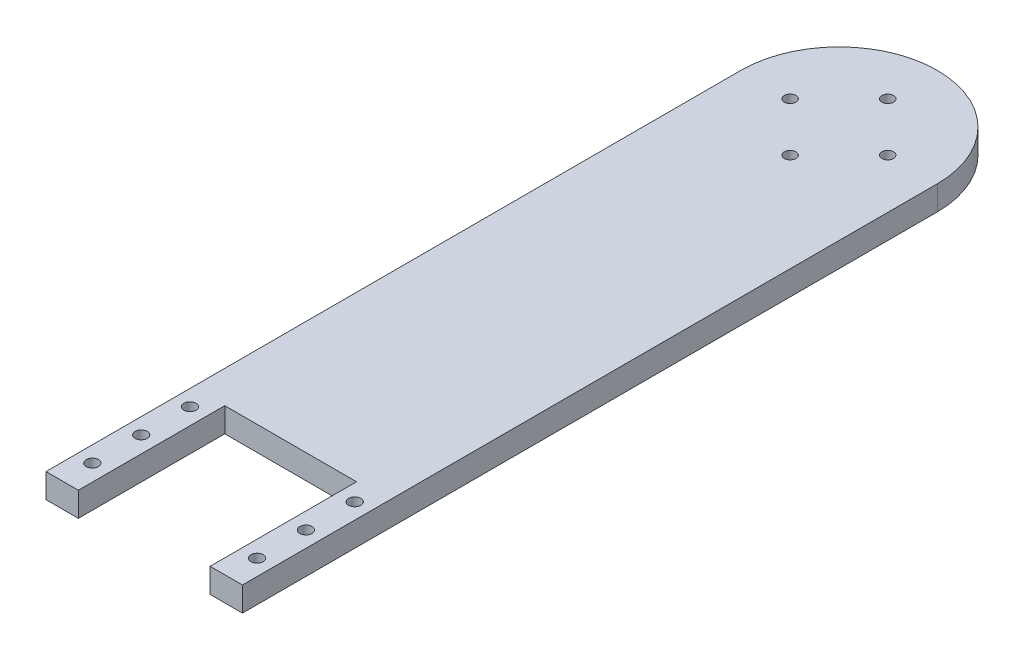
ISO-10303-21;
HEADER;
FILE_DESCRIPTION(('STEP AP214'),'2;1');
FILE_NAME('part.step','',(''),(''),'','','');
FILE_SCHEMA(('AUTOMOTIVE_DESIGN { 1 0 10303 214 1 1 1 1 }'));
ENDSEC;
DATA;
#1=APPLICATION_CONTEXT('core data for automotive mechanical design processes');
#2=APPLICATION_PROTOCOL_DEFINITION('international standard','automotive_design',2000,#1);
#3=PRODUCT_CONTEXT('',#1,'mechanical');
#4=PRODUCT('Part','Part','',(#3));
#5=PRODUCT_RELATED_PRODUCT_CATEGORY('part','',(#4));
#6=PRODUCT_DEFINITION_FORMATION('','',#4);
#7=PRODUCT_DEFINITION_CONTEXT('part definition',#1,'design');
#8=PRODUCT_DEFINITION('design','',#6,#7);
#9=PRODUCT_DEFINITION_SHAPE('','',#8);
#10=(LENGTH_UNIT() NAMED_UNIT(*) SI_UNIT(.MILLI.,.METRE.));
#11=(NAMED_UNIT(*) PLANE_ANGLE_UNIT() SI_UNIT($,.RADIAN.));
#12=(NAMED_UNIT(*) SI_UNIT($,.STERADIAN.) SOLID_ANGLE_UNIT());
#13=UNCERTAINTY_MEASURE_WITH_UNIT(LENGTH_MEASURE(1.E-05),#10,'distance_accuracy_value','');
#14=(GEOMETRIC_REPRESENTATION_CONTEXT(3) GLOBAL_UNCERTAINTY_ASSIGNED_CONTEXT((#13)) GLOBAL_UNIT_ASSIGNED_CONTEXT((#10,
#11,#12)) REPRESENTATION_CONTEXT('',''));
#15=CARTESIAN_POINT('',(0.,0.,0.));
#16=DIRECTION('',(0.,0.,1.));
#17=DIRECTION('',(1.,0.,0.));
#18=AXIS2_PLACEMENT_3D('',#15,#16,#17);
#19=CARTESIAN_POINT('',(-16.1,4.,113.9));
#20=DIRECTION('',(0.,0.,-1.));
#21=DIRECTION('',(-1.,0.,0.));
#22=AXIS2_PLACEMENT_3D('',#19,#20,#21);
#23=PLANE('',#22);
#24=DIRECTION('',(1.,0.,0.));
#25=VECTOR('',#24,1.);
#26=CARTESIAN_POINT('',(-16.1,4.,113.9));
#27=LINE('',#26,#25);
#28=CARTESIAN_POINT('',(10.8,4.,113.9));
#29=VERTEX_POINT('',#28);
#30=CARTESIAN_POINT('',(16.1,4.,113.9));
#31=VERTEX_POINT('',#30);
#32=EDGE_CURVE('E203',#29,#31,#27,.T.);
#33=ORIENTED_EDGE('',*,*,#32,.F.);
#34=DIRECTION('',(0.,1.,0.));
#35=VECTOR('',#34,1.);
#36=CARTESIAN_POINT('',(10.8,-6.,113.9));
#37=LINE('',#36,#35);
#38=CARTESIAN_POINT('',(10.8,0.,113.9));
#39=VERTEX_POINT('',#38);
#40=EDGE_CURVE('E134',#39,#29,#37,.T.);
#41=ORIENTED_EDGE('',*,*,#40,.F.);
#42=DIRECTION('',(1.,0.,0.));
#43=VECTOR('',#42,1.);
#44=CARTESIAN_POINT('',(-16.1,0.,113.9));
#45=LINE('',#44,#43);
#46=CARTESIAN_POINT('',(16.1,0.,113.9));
#47=VERTEX_POINT('',#46);
#48=EDGE_CURVE('E68',#39,#47,#45,.T.);
#49=ORIENTED_EDGE('',*,*,#48,.T.);
#50=DIRECTION('',(0.,-1.,0.));
#51=VECTOR('',#50,1.);
#52=CARTESIAN_POINT('',(16.1,4.,113.9));
#53=LINE('',#52,#51);
#54=EDGE_CURVE('E216',#31,#47,#53,.T.);
#55=ORIENTED_EDGE('',*,*,#54,.F.);
#56=EDGE_LOOP('',(#33,#41,#49,#55));
#57=FACE_BOUND('',#56,.T.);
#58=ADVANCED_FACE('F33',(#57),#23,.F.);
#59=CARTESIAN_POINT('',(-16.1,0.,113.9));
#60=VERTEX_POINT('',#59);
#61=CARTESIAN_POINT('',(-10.8,0.,113.9));
#62=VERTEX_POINT('',#61);
#63=EDGE_CURVE('E211',#60,#62,#45,.T.);
#64=ORIENTED_EDGE('',*,*,#63,.T.);
#65=DIRECTION('',(0.,1.,0.));
#66=VECTOR('',#65,1.);
#67=CARTESIAN_POINT('',(-10.8,-6.,113.9));
#68=LINE('',#67,#66);
#69=CARTESIAN_POINT('',(-10.8,4.,113.9));
#70=VERTEX_POINT('',#69);
#71=EDGE_CURVE('E119',#62,#70,#68,.T.);
#72=ORIENTED_EDGE('',*,*,#71,.T.);
#73=CARTESIAN_POINT('',(-16.1,4.,113.9));
#74=VERTEX_POINT('',#73);
#75=EDGE_CURVE('E131',#74,#70,#27,.T.);
#76=ORIENTED_EDGE('',*,*,#75,.F.);
#77=DIRECTION('',(0.,-1.,0.));
#78=VECTOR('',#77,1.);
#79=CARTESIAN_POINT('',(-16.1,4.,113.9));
#80=LINE('',#79,#78);
#81=EDGE_CURVE('E218',#74,#60,#80,.T.);
#82=ORIENTED_EDGE('',*,*,#81,.T.);
#83=EDGE_LOOP('',(#64,#72,#76,#82));
#84=FACE_BOUND('',#83,.T.);
#85=ADVANCED_FACE('F238',(#84),#23,.F.);
#86=CARTESIAN_POINT('',(0.,4.,0.));
#87=DIRECTION('',(0.,1.,0.));
#88=DIRECTION('',(0.,0.,1.));
#89=AXIS2_PLACEMENT_3D('',#86,#87,#88);
#90=PLANE('',#89);
#91=DIRECTION('',(0.,0.,1.));
#92=VECTOR('',#91,1.);
#93=CARTESIAN_POINT('',(-10.8,4.,0.));
#94=LINE('',#93,#92);
#95=CARTESIAN_POINT('',(-10.8,4.,89.9));
#96=VERTEX_POINT('',#95);
#97=EDGE_CURVE('E124',#96,#70,#94,.T.);
#98=ORIENTED_EDGE('',*,*,#97,.F.);
#99=DIRECTION('',(1.,0.,0.));
#100=VECTOR('',#99,1.);
#101=CARTESIAN_POINT('',(-8.68397598925233,4.,89.9));
#102=LINE('',#101,#100);
#103=CARTESIAN_POINT('',(10.8,4.,89.9));
#104=VERTEX_POINT('',#103);
#105=EDGE_CURVE('E109',#96,#104,#102,.T.);
#106=ORIENTED_EDGE('',*,*,#105,.T.);
#107=DIRECTION('',(0.,0.,-1.));
#108=VECTOR('',#107,1.);
#109=CARTESIAN_POINT('',(10.8,4.,113.9));
#110=LINE('',#109,#108);
#111=EDGE_CURVE('E132',#29,#104,#110,.T.);
#112=ORIENTED_EDGE('',*,*,#111,.F.);
#113=ORIENTED_EDGE('',*,*,#32,.T.);
#114=DIRECTION('',(0.,0.,-1.));
#115=VECTOR('',#114,1.);
#116=CARTESIAN_POINT('',(16.1,4.,113.9));
#117=LINE('',#116,#115);
#118=CARTESIAN_POINT('',(16.1,4.,0.));
#119=VERTEX_POINT('',#118);
#120=EDGE_CURVE('E50',#31,#119,#117,.T.);
#121=ORIENTED_EDGE('',*,*,#120,.T.);
#122=CARTESIAN_POINT('',(0.,4.,0.));
#123=DIRECTION('',(0.,1.,0.));
#124=DIRECTION('',(0.,0.,1.));
#125=AXIS2_PLACEMENT_3D('',#122,#123,#124);
#126=CIRCLE('',#125,16.1);
#127=CARTESIAN_POINT('',(-16.1,4.,0.));
#128=VERTEX_POINT('',#127);
#129=EDGE_CURVE('E200',#119,#128,#126,.T.);
#130=ORIENTED_EDGE('',*,*,#129,.T.);
#131=DIRECTION('',(0.,0.,1.));
#132=VECTOR('',#131,1.);
#133=CARTESIAN_POINT('',(-16.1,4.,0.));
#134=LINE('',#133,#132);
#135=EDGE_CURVE('E82',#128,#74,#134,.T.);
#136=ORIENTED_EDGE('',*,*,#135,.T.);
#137=ORIENTED_EDGE('',*,*,#75,.T.);
#138=EDGE_LOOP('',(#98,#106,#112,#113,#121,#130,#136,#137));
#139=FACE_BOUND('',#138,.T.);
#140=CARTESIAN_POINT('',(-0.0249024443971411,4.,-7.99772856499219));
#141=DIRECTION('',(0.,1.,0.));
#142=DIRECTION('',(0.,0.,1.));
#143=AXIS2_PLACEMENT_3D('',#140,#141,#142);
#144=CIRCLE('',#143,0.955);
#145=CARTESIAN_POINT('',(-0.0249024443971411,4.,-7.04272856499219));
#146=VERTEX_POINT('',#145);
#147=EDGE_CURVE('E153',#146,#146,#144,.T.);
#148=ORIENTED_EDGE('',*,*,#147,.F.);
#149=EDGE_LOOP('',(#148));
#150=FACE_BOUND('',#149,.T.);
#151=CARTESIAN_POINT('',(-13.5,4.,100.9));
#152=DIRECTION('',(0.,1.,0.));
#153=DIRECTION('',(0.,0.,1.));
#154=AXIS2_PLACEMENT_3D('',#151,#152,#153);
#155=CIRCLE('',#154,1.);
#156=CARTESIAN_POINT('',(-13.5,4.,101.9));
#157=VERTEX_POINT('',#156);
#158=EDGE_CURVE('E166',#157,#157,#155,.T.);
#159=ORIENTED_EDGE('',*,*,#158,.F.);
#160=EDGE_LOOP('',(#159));
#161=FACE_BOUND('',#160,.T.);
#162=CARTESIAN_POINT('',(-13.5,4.,92.9));
#163=DIRECTION('',(0.,1.,0.));
#164=DIRECTION('',(0.,0.,1.));
#165=AXIS2_PLACEMENT_3D('',#162,#163,#164);
#166=CIRCLE('',#165,1.);
#167=CARTESIAN_POINT('',(-13.5,4.,93.9));
#168=VERTEX_POINT('',#167);
#169=EDGE_CURVE('E173',#168,#168,#166,.T.);
#170=ORIENTED_EDGE('',*,*,#169,.F.);
#171=EDGE_LOOP('',(#170));
#172=FACE_BOUND('',#171,.T.);
#173=CARTESIAN_POINT('',(13.5,4.,92.9));
#174=DIRECTION('',(0.,1.,0.));
#175=DIRECTION('',(0.,0.,1.));
#176=AXIS2_PLACEMENT_3D('',#173,#174,#175);
#177=CIRCLE('',#176,1.);
#178=CARTESIAN_POINT('',(13.5,4.,93.9));
#179=VERTEX_POINT('',#178);
#180=EDGE_CURVE('E179',#179,#179,#177,.T.);
#181=ORIENTED_EDGE('',*,*,#180,.F.);
#182=EDGE_LOOP('',(#181));
#183=FACE_BOUND('',#182,.T.);
#184=CARTESIAN_POINT('',(13.5,4.,100.9));
#185=DIRECTION('',(0.,1.,0.));
#186=DIRECTION('',(0.,0.,1.));
#187=AXIS2_PLACEMENT_3D('',#184,#185,#186);
#188=CIRCLE('',#187,1.);
#189=CARTESIAN_POINT('',(13.5,4.,101.9));
#190=VERTEX_POINT('',#189);
#191=EDGE_CURVE('E185',#190,#190,#188,.T.);
#192=ORIENTED_EDGE('',*,*,#191,.F.);
#193=EDGE_LOOP('',(#192));
#194=FACE_BOUND('',#193,.T.);
#195=CARTESIAN_POINT('',(7.97509755560286,4.,0.00227143500781436));
#196=DIRECTION('',(0.,1.,0.));
#197=DIRECTION('',(0.,0.,1.));
#198=AXIS2_PLACEMENT_3D('',#195,#196,#197);
#199=CIRCLE('',#198,0.954999999999999);
#200=CARTESIAN_POINT('',(7.97509755560286,4.,0.957271435007814));
#201=VERTEX_POINT('',#200);
#202=EDGE_CURVE('E147',#201,#201,#199,.T.);
#203=ORIENTED_EDGE('',*,*,#202,.F.);
#204=EDGE_LOOP('',(#203));
#205=FACE_BOUND('',#204,.T.);
#206=CARTESIAN_POINT('',(-0.0249024443971411,4.,8.00227143500781));
#207=DIRECTION('',(0.,1.,0.));
#208=DIRECTION('',(0.,0.,1.));
#209=AXIS2_PLACEMENT_3D('',#206,#207,#208);
#210=CIRCLE('',#209,0.955);
#211=CARTESIAN_POINT('',(-0.0249024443971411,4.,8.95727143500781));
#212=VERTEX_POINT('',#211);
#213=EDGE_CURVE('E140',#212,#212,#210,.T.);
#214=ORIENTED_EDGE('',*,*,#213,.F.);
#215=EDGE_LOOP('',(#214));
#216=FACE_BOUND('',#215,.T.);
#217=CARTESIAN_POINT('',(-8.02490244439714,4.,0.00227143500781436));
#218=DIRECTION('',(0.,1.,0.));
#219=DIRECTION('',(0.,0.,1.));
#220=AXIS2_PLACEMENT_3D('',#217,#218,#219);
#221=CIRCLE('',#220,0.955);
#222=CARTESIAN_POINT('',(-8.02490244439714,4.,0.957271435007815));
#223=VERTEX_POINT('',#222);
#224=EDGE_CURVE('E161',#223,#223,#221,.T.);
#225=ORIENTED_EDGE('',*,*,#224,.F.);
#226=EDGE_LOOP('',(#225));
#227=FACE_BOUND('',#226,.T.);
#228=CARTESIAN_POINT('',(13.5,4.,108.9));
#229=DIRECTION('',(0.,1.,0.));
#230=DIRECTION('',(0.,0.,1.));
#231=AXIS2_PLACEMENT_3D('',#228,#229,#230);
#232=CIRCLE('',#231,1.);
#233=CARTESIAN_POINT('',(13.5,4.,109.9));
#234=VERTEX_POINT('',#233);
#235=EDGE_CURVE('E154',#234,#234,#232,.T.);
#236=ORIENTED_EDGE('',*,*,#235,.F.);
#237=EDGE_LOOP('',(#236));
#238=FACE_BOUND('',#237,.T.);
#239=CARTESIAN_POINT('',(-13.5,4.,108.9));
#240=DIRECTION('',(0.,1.,0.));
#241=DIRECTION('',(0.,0.,1.));
#242=AXIS2_PLACEMENT_3D('',#239,#240,#241);
#243=CIRCLE('',#242,1.);
#244=CARTESIAN_POINT('',(-13.5,4.,109.9));
#245=VERTEX_POINT('',#244);
#246=EDGE_CURVE('E169',#245,#245,#243,.T.);
#247=ORIENTED_EDGE('',*,*,#246,.F.);
#248=EDGE_LOOP('',(#247));
#249=FACE_BOUND('',#248,.T.);
#250=ADVANCED_FACE('F128',(#139,#150,#161,#172,#183,#194,#205,#216,#227,#238,#249),#90,.T.);
#251=CARTESIAN_POINT('',(0.,0.,0.));
#252=DIRECTION('',(0.,1.,0.));
#253=DIRECTION('',(0.,0.,1.));
#254=AXIS2_PLACEMENT_3D('',#251,#252,#253);
#255=PLANE('',#254);
#256=CARTESIAN_POINT('',(-13.5,0.,108.9));
#257=DIRECTION('',(0.,1.,0.));
#258=DIRECTION('',(0.,0.,1.));
#259=AXIS2_PLACEMENT_3D('',#256,#257,#258);
#260=CIRCLE('',#259,1.);
#261=CARTESIAN_POINT('',(-13.5,0.,109.9));
#262=VERTEX_POINT('',#261);
#263=EDGE_CURVE('E194',#262,#262,#260,.T.);
#264=ORIENTED_EDGE('',*,*,#263,.T.);
#265=EDGE_LOOP('',(#264));
#266=FACE_BOUND('',#265,.T.);
#267=CARTESIAN_POINT('',(13.5,0.,108.9));
#268=DIRECTION('',(0.,1.,0.));
#269=DIRECTION('',(0.,0.,1.));
#270=AXIS2_PLACEMENT_3D('',#267,#268,#269);
#271=CIRCLE('',#270,1.);
#272=CARTESIAN_POINT('',(13.5,0.,109.9));
#273=VERTEX_POINT('',#272);
#274=EDGE_CURVE('E158',#273,#273,#271,.T.);
#275=ORIENTED_EDGE('',*,*,#274,.T.);
#276=EDGE_LOOP('',(#275));
#277=FACE_BOUND('',#276,.T.);
#278=CARTESIAN_POINT('',(-8.02490244439714,0.,0.00227143500781436));
#279=DIRECTION('',(0.,1.,0.));
#280=DIRECTION('',(0.,0.,1.));
#281=AXIS2_PLACEMENT_3D('',#278,#279,#280);
#282=CIRCLE('',#281,0.955);
#283=CARTESIAN_POINT('',(-8.02490244439714,0.,0.957271435007815));
#284=VERTEX_POINT('',#283);
#285=EDGE_CURVE('E143',#284,#284,#282,.T.);
#286=ORIENTED_EDGE('',*,*,#285,.T.);
#287=EDGE_LOOP('',(#286));
#288=FACE_BOUND('',#287,.T.);
#289=CARTESIAN_POINT('',(-0.0249024443971411,0.,8.00227143500781));
#290=DIRECTION('',(0.,1.,0.));
#291=DIRECTION('',(0.,0.,1.));
#292=AXIS2_PLACEMENT_3D('',#289,#290,#291);
#293=CIRCLE('',#292,0.955);
#294=CARTESIAN_POINT('',(-0.0249024443971411,0.,8.95727143500781));
#295=VERTEX_POINT('',#294);
#296=EDGE_CURVE('E144',#295,#295,#293,.T.);
#297=ORIENTED_EDGE('',*,*,#296,.T.);
#298=EDGE_LOOP('',(#297));
#299=FACE_BOUND('',#298,.T.);
#300=CARTESIAN_POINT('',(7.97509755560286,0.,0.00227143500781436));
#301=DIRECTION('',(0.,1.,0.));
#302=DIRECTION('',(0.,0.,1.));
#303=AXIS2_PLACEMENT_3D('',#300,#301,#302);
#304=CIRCLE('',#303,0.954999999999999);
#305=CARTESIAN_POINT('',(7.97509755560286,0.,0.957271435007814));
#306=VERTEX_POINT('',#305);
#307=EDGE_CURVE('E150',#306,#306,#304,.T.);
#308=ORIENTED_EDGE('',*,*,#307,.T.);
#309=EDGE_LOOP('',(#308));
#310=FACE_BOUND('',#309,.T.);
#311=CARTESIAN_POINT('',(13.5,0.,100.9));
#312=DIRECTION('',(0.,1.,0.));
#313=DIRECTION('',(0.,0.,1.));
#314=AXIS2_PLACEMENT_3D('',#311,#312,#313);
#315=CIRCLE('',#314,1.);
#316=CARTESIAN_POINT('',(13.5,0.,101.9));
#317=VERTEX_POINT('',#316);
#318=EDGE_CURVE('E157',#317,#317,#315,.T.);
#319=ORIENTED_EDGE('',*,*,#318,.T.);
#320=EDGE_LOOP('',(#319));
#321=FACE_BOUND('',#320,.T.);
#322=CARTESIAN_POINT('',(13.5,0.,92.9));
#323=DIRECTION('',(0.,1.,0.));
#324=DIRECTION('',(0.,0.,1.));
#325=AXIS2_PLACEMENT_3D('',#322,#323,#324);
#326=CIRCLE('',#325,1.);
#327=CARTESIAN_POINT('',(13.5,0.,93.9));
#328=VERTEX_POINT('',#327);
#329=EDGE_CURVE('E182',#328,#328,#326,.T.);
#330=ORIENTED_EDGE('',*,*,#329,.T.);
#331=EDGE_LOOP('',(#330));
#332=FACE_BOUND('',#331,.T.);
#333=CARTESIAN_POINT('',(-13.5,0.,92.9));
#334=DIRECTION('',(0.,1.,0.));
#335=DIRECTION('',(0.,0.,1.));
#336=AXIS2_PLACEMENT_3D('',#333,#334,#335);
#337=CIRCLE('',#336,1.);
#338=CARTESIAN_POINT('',(-13.5,0.,93.9));
#339=VERTEX_POINT('',#338);
#340=EDGE_CURVE('E176',#339,#339,#337,.T.);
#341=ORIENTED_EDGE('',*,*,#340,.T.);
#342=EDGE_LOOP('',(#341));
#343=FACE_BOUND('',#342,.T.);
#344=CARTESIAN_POINT('',(-13.5,0.,100.9));
#345=DIRECTION('',(0.,1.,0.));
#346=DIRECTION('',(0.,0.,1.));
#347=AXIS2_PLACEMENT_3D('',#344,#345,#346);
#348=CIRCLE('',#347,1.);
#349=CARTESIAN_POINT('',(-13.5,0.,101.9));
#350=VERTEX_POINT('',#349);
#351=EDGE_CURVE('E170',#350,#350,#348,.T.);
#352=ORIENTED_EDGE('',*,*,#351,.T.);
#353=EDGE_LOOP('',(#352));
#354=FACE_BOUND('',#353,.T.);
#355=CARTESIAN_POINT('',(-0.0249024443971411,0.,-7.99772856499219));
#356=DIRECTION('',(0.,1.,0.));
#357=DIRECTION('',(0.,0.,1.));
#358=AXIS2_PLACEMENT_3D('',#355,#356,#357);
#359=CIRCLE('',#358,0.955);
#360=CARTESIAN_POINT('',(-0.0249024443971411,0.,-7.04272856499219));
#361=VERTEX_POINT('',#360);
#362=EDGE_CURVE('E118',#361,#361,#359,.T.);
#363=ORIENTED_EDGE('',*,*,#362,.T.);
#364=EDGE_LOOP('',(#363));
#365=FACE_BOUND('',#364,.T.);
#366=DIRECTION('',(1.,0.,0.));
#367=VECTOR('',#366,1.);
#368=CARTESIAN_POINT('',(0.,0.,89.9));
#369=LINE('',#368,#367);
#370=CARTESIAN_POINT('',(-10.8,0.,89.9));
#371=VERTEX_POINT('',#370);
#372=CARTESIAN_POINT('',(10.8,0.,89.9));
#373=VERTEX_POINT('',#372);
#374=EDGE_CURVE('E223',#371,#373,#369,.T.);
#375=ORIENTED_EDGE('',*,*,#374,.F.);
#376=DIRECTION('',(0.,0.,1.));
#377=VECTOR('',#376,1.);
#378=CARTESIAN_POINT('',(-10.8,0.,0.));
#379=LINE('',#378,#377);
#380=EDGE_CURVE('E11',#371,#62,#379,.T.);
#381=ORIENTED_EDGE('',*,*,#380,.T.);
#382=ORIENTED_EDGE('',*,*,#63,.F.);
#383=DIRECTION('',(0.,0.,1.));
#384=VECTOR('',#383,1.);
#385=CARTESIAN_POINT('',(-16.1,0.,0.));
#386=LINE('',#385,#384);
#387=CARTESIAN_POINT('',(-16.1,0.,0.));
#388=VERTEX_POINT('',#387);
#389=EDGE_CURVE('E209',#388,#60,#386,.T.);
#390=ORIENTED_EDGE('',*,*,#389,.F.);
#391=CARTESIAN_POINT('',(0.,0.,0.));
#392=DIRECTION('',(0.,1.,0.));
#393=DIRECTION('',(0.,0.,1.));
#394=AXIS2_PLACEMENT_3D('',#391,#392,#393);
#395=CIRCLE('',#394,16.1);
#396=CARTESIAN_POINT('',(16.1,0.,0.));
#397=VERTEX_POINT('',#396);
#398=EDGE_CURVE('E197',#397,#388,#395,.T.);
#399=ORIENTED_EDGE('',*,*,#398,.F.);
#400=DIRECTION('',(0.,0.,-1.));
#401=VECTOR('',#400,1.);
#402=CARTESIAN_POINT('',(16.1,0.,113.9));
#403=LINE('',#402,#401);
#404=EDGE_CURVE('E74',#47,#397,#403,.T.);
#405=ORIENTED_EDGE('',*,*,#404,.F.);
#406=ORIENTED_EDGE('',*,*,#48,.F.);
#407=DIRECTION('',(0.,0.,-1.));
#408=VECTOR('',#407,1.);
#409=CARTESIAN_POINT('',(10.8,0.,0.));
#410=LINE('',#409,#408);
#411=EDGE_CURVE('E42',#39,#373,#410,.T.);
#412=ORIENTED_EDGE('',*,*,#411,.T.);
#413=EDGE_LOOP('',(#375,#381,#382,#390,#399,#405,#406,#412));
#414=FACE_BOUND('',#413,.T.);
#415=ADVANCED_FACE('F226',(#266,#277,#288,#299,#310,#321,#332,#343,#354,#365,#414),#255,.F.);
#416=CARTESIAN_POINT('',(0.,4.,0.));
#417=DIRECTION('',(0.,-1.,0.));
#418=DIRECTION('',(0.,0.,-1.));
#419=AXIS2_PLACEMENT_3D('',#416,#417,#418);
#420=CYLINDRICAL_SURFACE('',#419,16.1);
#421=ORIENTED_EDGE('',*,*,#398,.T.);
#422=DIRECTION('',(0.,-1.,0.));
#423=VECTOR('',#422,1.);
#424=CARTESIAN_POINT('',(-16.1,4.,0.));
#425=LINE('',#424,#423);
#426=EDGE_CURVE('E221',#128,#388,#425,.T.);
#427=ORIENTED_EDGE('',*,*,#426,.F.);
#428=ORIENTED_EDGE('',*,*,#129,.F.);
#429=DIRECTION('',(0.,-1.,0.));
#430=VECTOR('',#429,1.);
#431=CARTESIAN_POINT('',(16.1,4.,0.));
#432=LINE('',#431,#430);
#433=EDGE_CURVE('E206',#119,#397,#432,.T.);
#434=ORIENTED_EDGE('',*,*,#433,.T.);
#435=EDGE_LOOP('',(#421,#427,#428,#434));
#436=FACE_BOUND('',#435,.T.);
#437=ADVANCED_FACE('F35',(#436),#420,.T.);
#438=CARTESIAN_POINT('',(-16.1,4.,0.));
#439=DIRECTION('',(1.,0.,0.));
#440=DIRECTION('',(0.,0.,-1.));
#441=AXIS2_PLACEMENT_3D('',#438,#439,#440);
#442=PLANE('',#441);
#443=ORIENTED_EDGE('',*,*,#389,.T.);
#444=ORIENTED_EDGE('',*,*,#81,.F.);
#445=ORIENTED_EDGE('',*,*,#135,.F.);
#446=ORIENTED_EDGE('',*,*,#426,.T.);
#447=EDGE_LOOP('',(#443,#444,#445,#446));
#448=FACE_BOUND('',#447,.T.);
#449=ADVANCED_FACE('F235',(#448),#442,.F.);
#450=CARTESIAN_POINT('',(16.1,4.,113.9));
#451=DIRECTION('',(-1.,0.,0.));
#452=DIRECTION('',(0.,0.,1.));
#453=AXIS2_PLACEMENT_3D('',#450,#451,#452);
#454=PLANE('',#453);
#455=ORIENTED_EDGE('',*,*,#404,.T.);
#456=ORIENTED_EDGE('',*,*,#433,.F.);
#457=ORIENTED_EDGE('',*,*,#120,.F.);
#458=ORIENTED_EDGE('',*,*,#54,.T.);
#459=EDGE_LOOP('',(#455,#456,#457,#458));
#460=FACE_BOUND('',#459,.T.);
#461=ADVANCED_FACE('F230',(#460),#454,.F.);
#462=CARTESIAN_POINT('',(-13.5,0.,108.9));
#463=DIRECTION('',(0.,1.,0.));
#464=DIRECTION('',(0.,0.,1.));
#465=AXIS2_PLACEMENT_3D('',#462,#463,#464);
#466=CYLINDRICAL_SURFACE('',#465,1.);
#467=ORIENTED_EDGE('',*,*,#263,.F.);
#468=EDGE_LOOP('',(#467));
#469=FACE_BOUND('',#468,.T.);
#470=ORIENTED_EDGE('',*,*,#246,.T.);
#471=EDGE_LOOP('',(#470));
#472=FACE_BOUND('',#471,.T.);
#473=ADVANCED_FACE('F253',(#469,#472),#466,.F.);
#474=CARTESIAN_POINT('',(13.5,0.,108.9));
#475=DIRECTION('',(0.,1.,0.));
#476=DIRECTION('',(0.,0.,1.));
#477=AXIS2_PLACEMENT_3D('',#474,#475,#476);
#478=CYLINDRICAL_SURFACE('',#477,1.);
#479=ORIENTED_EDGE('',*,*,#274,.F.);
#480=EDGE_LOOP('',(#479));
#481=FACE_BOUND('',#480,.T.);
#482=ORIENTED_EDGE('',*,*,#235,.T.);
#483=EDGE_LOOP('',(#482));
#484=FACE_BOUND('',#483,.T.);
#485=ADVANCED_FACE('F264',(#481,#484),#478,.F.);
#486=CARTESIAN_POINT('',(-8.02490244439714,0.,0.00227143500781436));
#487=DIRECTION('',(0.,1.,0.));
#488=DIRECTION('',(0.,0.,1.));
#489=AXIS2_PLACEMENT_3D('',#486,#487,#488);
#490=CYLINDRICAL_SURFACE('',#489,0.955);
#491=ORIENTED_EDGE('',*,*,#285,.F.);
#492=EDGE_LOOP('',(#491));
#493=FACE_BOUND('',#492,.T.);
#494=ORIENTED_EDGE('',*,*,#224,.T.);
#495=EDGE_LOOP('',(#494));
#496=FACE_BOUND('',#495,.T.);
#497=ADVANCED_FACE('F287',(#493,#496),#490,.F.);
#498=CARTESIAN_POINT('',(-0.0249024443971411,0.,8.00227143500781));
#499=DIRECTION('',(0.,1.,0.));
#500=DIRECTION('',(0.,0.,1.));
#501=AXIS2_PLACEMENT_3D('',#498,#499,#500);
#502=CYLINDRICAL_SURFACE('',#501,0.955);
#503=ORIENTED_EDGE('',*,*,#296,.F.);
#504=EDGE_LOOP('',(#503));
#505=FACE_BOUND('',#504,.T.);
#506=ORIENTED_EDGE('',*,*,#213,.T.);
#507=EDGE_LOOP('',(#506));
#508=FACE_BOUND('',#507,.T.);
#509=ADVANCED_FACE('F290',(#505,#508),#502,.F.);
#510=CARTESIAN_POINT('',(7.97509755560286,0.,0.00227143500781436));
#511=DIRECTION('',(0.,1.,0.));
#512=DIRECTION('',(0.,0.,1.));
#513=AXIS2_PLACEMENT_3D('',#510,#511,#512);
#514=CYLINDRICAL_SURFACE('',#513,0.954999999999999);
#515=ORIENTED_EDGE('',*,*,#307,.F.);
#516=EDGE_LOOP('',(#515));
#517=FACE_BOUND('',#516,.T.);
#518=ORIENTED_EDGE('',*,*,#202,.T.);
#519=EDGE_LOOP('',(#518));
#520=FACE_BOUND('',#519,.T.);
#521=ADVANCED_FACE('F275',(#517,#520),#514,.F.);
#522=CARTESIAN_POINT('',(13.5,0.,100.9));
#523=DIRECTION('',(0.,1.,0.));
#524=DIRECTION('',(0.,0.,1.));
#525=AXIS2_PLACEMENT_3D('',#522,#523,#524);
#526=CYLINDRICAL_SURFACE('',#525,1.);
#527=ORIENTED_EDGE('',*,*,#318,.F.);
#528=EDGE_LOOP('',(#527));
#529=FACE_BOUND('',#528,.T.);
#530=ORIENTED_EDGE('',*,*,#191,.T.);
#531=EDGE_LOOP('',(#530));
#532=FACE_BOUND('',#531,.T.);
#533=ADVANCED_FACE('F271',(#529,#532),#526,.F.);
#534=CARTESIAN_POINT('',(13.5,0.,92.9));
#535=DIRECTION('',(0.,1.,0.));
#536=DIRECTION('',(0.,0.,1.));
#537=AXIS2_PLACEMENT_3D('',#534,#535,#536);
#538=CYLINDRICAL_SURFACE('',#537,1.);
#539=ORIENTED_EDGE('',*,*,#329,.F.);
#540=EDGE_LOOP('',(#539));
#541=FACE_BOUND('',#540,.T.);
#542=ORIENTED_EDGE('',*,*,#180,.T.);
#543=EDGE_LOOP('',(#542));
#544=FACE_BOUND('',#543,.T.);
#545=ADVANCED_FACE('F274',(#541,#544),#538,.F.);
#546=CARTESIAN_POINT('',(-13.5,0.,92.9));
#547=DIRECTION('',(0.,1.,0.));
#548=DIRECTION('',(0.,0.,1.));
#549=AXIS2_PLACEMENT_3D('',#546,#547,#548);
#550=CYLINDRICAL_SURFACE('',#549,1.);
#551=ORIENTED_EDGE('',*,*,#340,.F.);
#552=EDGE_LOOP('',(#551));
#553=FACE_BOUND('',#552,.T.);
#554=ORIENTED_EDGE('',*,*,#169,.T.);
#555=EDGE_LOOP('',(#554));
#556=FACE_BOUND('',#555,.T.);
#557=ADVANCED_FACE('F279',(#553,#556),#550,.F.);
#558=CARTESIAN_POINT('',(-13.5,0.,100.9));
#559=DIRECTION('',(0.,1.,0.));
#560=DIRECTION('',(0.,0.,1.));
#561=AXIS2_PLACEMENT_3D('',#558,#559,#560);
#562=CYLINDRICAL_SURFACE('',#561,1.);
#563=ORIENTED_EDGE('',*,*,#351,.F.);
#564=EDGE_LOOP('',(#563));
#565=FACE_BOUND('',#564,.T.);
#566=ORIENTED_EDGE('',*,*,#158,.T.);
#567=EDGE_LOOP('',(#566));
#568=FACE_BOUND('',#567,.T.);
#569=ADVANCED_FACE('F269',(#565,#568),#562,.F.);
#570=CARTESIAN_POINT('',(-0.0249024443971411,0.,-7.99772856499219));
#571=DIRECTION('',(0.,1.,0.));
#572=DIRECTION('',(0.,0.,1.));
#573=AXIS2_PLACEMENT_3D('',#570,#571,#572);
#574=CYLINDRICAL_SURFACE('',#573,0.955);
#575=ORIENTED_EDGE('',*,*,#362,.F.);
#576=EDGE_LOOP('',(#575));
#577=FACE_BOUND('',#576,.T.);
#578=ORIENTED_EDGE('',*,*,#147,.T.);
#579=EDGE_LOOP('',(#578));
#580=FACE_BOUND('',#579,.T.);
#581=ADVANCED_FACE('F266',(#577,#580),#574,.F.);
#582=CARTESIAN_POINT('',(-8.68397598925233,-6.,89.9));
#583=DIRECTION('',(0.,0.,1.));
#584=DIRECTION('',(1.,0.,0.));
#585=AXIS2_PLACEMENT_3D('',#582,#583,#584);
#586=PLANE('',#585);
#587=ORIENTED_EDGE('',*,*,#374,.T.);
#588=DIRECTION('',(0.,1.,0.));
#589=VECTOR('',#588,1.);
#590=CARTESIAN_POINT('',(10.8,-6.,89.9));
#591=LINE('',#590,#589);
#592=EDGE_CURVE('E114',#373,#104,#591,.T.);
#593=ORIENTED_EDGE('',*,*,#592,.T.);
#594=ORIENTED_EDGE('',*,*,#105,.F.);
#595=DIRECTION('',(0.,1.,0.));
#596=VECTOR('',#595,1.);
#597=CARTESIAN_POINT('',(-10.8,-6.,89.9));
#598=LINE('',#597,#596);
#599=EDGE_CURVE('E112',#371,#96,#598,.T.);
#600=ORIENTED_EDGE('',*,*,#599,.F.);
#601=EDGE_LOOP('',(#587,#593,#594,#600));
#602=FACE_BOUND('',#601,.T.);
#603=ADVANCED_FACE('F111',(#602),#586,.T.);
#604=CARTESIAN_POINT('',(-10.8,-6.,0.));
#605=DIRECTION('',(-1.,0.,0.));
#606=DIRECTION('',(0.,0.,1.));
#607=AXIS2_PLACEMENT_3D('',#604,#605,#606);
#608=PLANE('',#607);
#609=ORIENTED_EDGE('',*,*,#599,.T.);
#610=ORIENTED_EDGE('',*,*,#97,.T.);
#611=ORIENTED_EDGE('',*,*,#71,.F.);
#612=ORIENTED_EDGE('',*,*,#380,.F.);
#613=EDGE_LOOP('',(#609,#610,#611,#612));
#614=FACE_BOUND('',#613,.T.);
#615=ADVANCED_FACE('F123',(#614),#608,.F.);
#616=CARTESIAN_POINT('',(10.8,-6.,113.9));
#617=DIRECTION('',(1.,0.,0.));
#618=DIRECTION('',(0.,0.,-1.));
#619=AXIS2_PLACEMENT_3D('',#616,#617,#618);
#620=PLANE('',#619);
#621=ORIENTED_EDGE('',*,*,#40,.T.);
#622=ORIENTED_EDGE('',*,*,#111,.T.);
#623=ORIENTED_EDGE('',*,*,#592,.F.);
#624=ORIENTED_EDGE('',*,*,#411,.F.);
#625=EDGE_LOOP('',(#621,#622,#623,#624));
#626=FACE_BOUND('',#625,.T.);
#627=ADVANCED_FACE('F228',(#626),#620,.F.);
#628=CLOSED_SHELL('',(#58,#85,#250,#415,#437,#449,#461,#473,#485,#497,#509,#521,#533,#545,#557,
#569,#581,#603,#615,#627));
#629=MANIFOLD_SOLID_BREP('B2',#628);
#630=ADVANCED_BREP_SHAPE_REPRESENTATION('',(#18,#629),#14);
#631=SHAPE_DEFINITION_REPRESENTATION(#9,#630);
ENDSEC;
END-ISO-10303-21;
